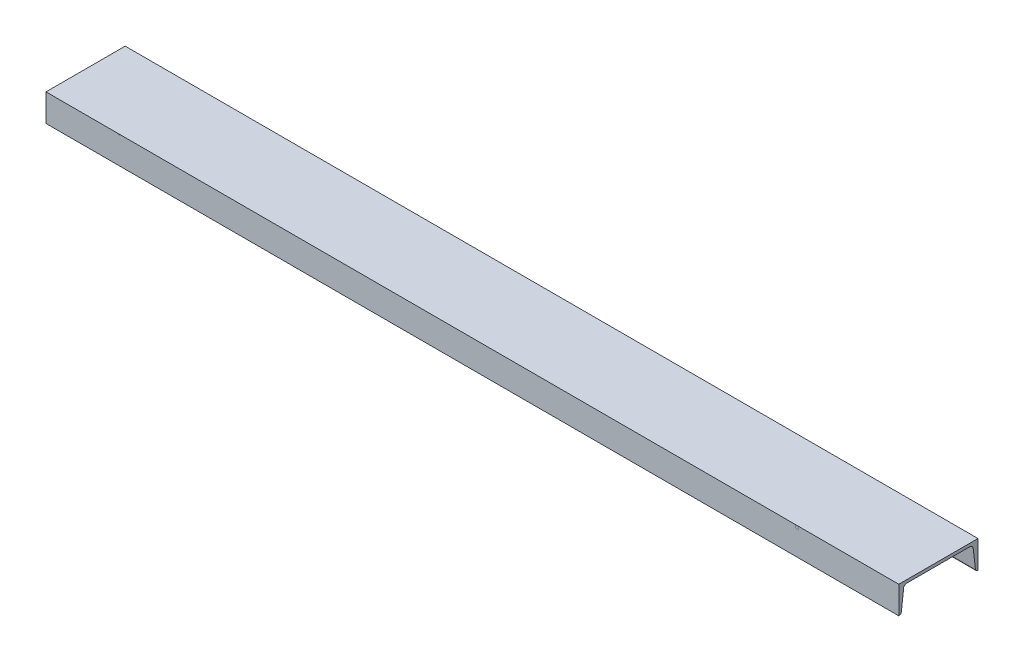
ISO-10303-21;
HEADER;
FILE_DESCRIPTION(('STEP AP214'),'2;1');
FILE_NAME('part.step','',(''),(''),'','','');
FILE_SCHEMA(('AUTOMOTIVE_DESIGN { 1 0 10303 214 1 1 1 1 }'));
ENDSEC;
DATA;
#1=APPLICATION_CONTEXT('core data for automotive mechanical design processes');
#2=APPLICATION_PROTOCOL_DEFINITION('international standard','automotive_design',2000,#1);
#3=PRODUCT_CONTEXT('',#1,'mechanical');
#4=PRODUCT('Part','Part','',(#3));
#5=PRODUCT_RELATED_PRODUCT_CATEGORY('part','',(#4));
#6=PRODUCT_DEFINITION_FORMATION('','',#4);
#7=PRODUCT_DEFINITION_CONTEXT('part definition',#1,'design');
#8=PRODUCT_DEFINITION('design','',#6,#7);
#9=PRODUCT_DEFINITION_SHAPE('','',#8);
#10=(LENGTH_UNIT() NAMED_UNIT(*) SI_UNIT(.MILLI.,.METRE.));
#11=(NAMED_UNIT(*) PLANE_ANGLE_UNIT() SI_UNIT($,.RADIAN.));
#12=(NAMED_UNIT(*) SI_UNIT($,.STERADIAN.) SOLID_ANGLE_UNIT());
#13=UNCERTAINTY_MEASURE_WITH_UNIT(LENGTH_MEASURE(1.E-05),#10,'distance_accuracy_value','');
#14=(GEOMETRIC_REPRESENTATION_CONTEXT(3) GLOBAL_UNCERTAINTY_ASSIGNED_CONTEXT((#13)) GLOBAL_UNIT_ASSIGNED_CONTEXT((#10,
#11,#12)) REPRESENTATION_CONTEXT('',''));
#15=CARTESIAN_POINT('',(0.,0.,0.));
#16=DIRECTION('',(0.,0.,1.));
#17=DIRECTION('',(1.,0.,0.));
#18=AXIS2_PLACEMENT_3D('',#15,#16,#17);
#19=CARTESIAN_POINT('',(2800.,0.,130.));
#20=DIRECTION('',(0.,0.,-1.));
#21=DIRECTION('',(-1.,0.,0.));
#22=AXIS2_PLACEMENT_3D('',#19,#20,#21);
#23=PLANE('',#22);
#24=DIRECTION('',(1.,0.,0.));
#25=VECTOR('',#24,1.);
#26=CARTESIAN_POINT('',(2460.,-10.,130.));
#27=LINE('',#26,#25);
#28=CARTESIAN_POINT('',(2460.,-10.,130.));
#29=VERTEX_POINT('',#28);
#30=CARTESIAN_POINT('',(2470.,-10.,130.));
#31=VERTEX_POINT('',#30);
#32=EDGE_CURVE('E195',#29,#31,#27,.T.);
#33=ORIENTED_EDGE('',*,*,#32,.F.);
#34=DIRECTION('',(0.,-1.,0.));
#35=VECTOR('',#34,1.);
#36=CARTESIAN_POINT('',(2460.,0.,130.));
#37=LINE('',#36,#35);
#38=CARTESIAN_POINT('',(2460.,0.,130.));
#39=VERTEX_POINT('',#38);
#40=EDGE_CURVE('E180',#39,#29,#37,.T.);
#41=ORIENTED_EDGE('',*,*,#40,.F.);
#42=DIRECTION('',(-1.,0.,0.));
#43=VECTOR('',#42,1.);
#44=CARTESIAN_POINT('',(2800.,0.,130.));
#45=LINE('',#44,#43);
#46=CARTESIAN_POINT('',(241.376099803273,0.,130.));
#47=VERTEX_POINT('',#46);
#48=EDGE_CURVE('E290',#39,#47,#45,.T.);
#49=ORIENTED_EDGE('',*,*,#48,.T.);
#50=DIRECTION('',(0.,1.,0.));
#51=VECTOR('',#50,1.);
#52=CARTESIAN_POINT('',(241.376099803273,0.,130.));
#53=LINE('',#52,#51);
#54=CARTESIAN_POINT('',(241.376099803273,-3.41175440354588,130.));
#55=VERTEX_POINT('',#54);
#56=EDGE_CURVE('E204',#55,#47,#53,.T.);
#57=ORIENTED_EDGE('',*,*,#56,.F.);
#58=DIRECTION('',(1.,0.,0.));
#59=VECTOR('',#58,1.);
#60=CARTESIAN_POINT('',(241.376099803273,-3.41175440354588,130.));
#61=LINE('',#60,#59);
#62=CARTESIAN_POINT('',(237.964345399727,-3.41175440354588,130.));
#63=VERTEX_POINT('',#62);
#64=EDGE_CURVE('E211',#63,#55,#61,.T.);
#65=ORIENTED_EDGE('',*,*,#64,.F.);
#66=DIRECTION('',(0.,-1.,0.));
#67=VECTOR('',#66,1.);
#68=CARTESIAN_POINT('',(237.964345399727,0.,130.));
#69=LINE('',#68,#67);
#70=CARTESIAN_POINT('',(237.964345399727,0.,130.));
#71=VERTEX_POINT('',#70);
#72=EDGE_CURVE('E221',#71,#63,#69,.T.);
#73=ORIENTED_EDGE('',*,*,#72,.F.);
#74=CARTESIAN_POINT('',(0.,0.,130.));
#75=VERTEX_POINT('',#74);
#76=EDGE_CURVE('E261',#71,#75,#45,.T.);
#77=ORIENTED_EDGE('',*,*,#76,.T.);
#78=DIRECTION('',(0.,-1.,0.));
#79=VECTOR('',#78,1.);
#80=CARTESIAN_POINT('',(0.,0.,130.));
#81=LINE('',#80,#79);
#82=CARTESIAN_POINT('',(0.,-90.,130.));
#83=VERTEX_POINT('',#82);
#84=EDGE_CURVE('E228',#75,#83,#81,.T.);
#85=ORIENTED_EDGE('',*,*,#84,.T.);
#86=DIRECTION('',(-1.,0.,0.));
#87=VECTOR('',#86,1.);
#88=CARTESIAN_POINT('',(2800.,-90.,130.));
#89=LINE('',#88,#87);
#90=CARTESIAN_POINT('',(2800.,-90.,130.));
#91=VERTEX_POINT('',#90);
#92=EDGE_CURVE('E11',#91,#83,#89,.T.);
#93=ORIENTED_EDGE('',*,*,#92,.F.);
#94=DIRECTION('',(0.,-1.,0.));
#95=VECTOR('',#94,1.);
#96=CARTESIAN_POINT('',(2800.,0.,130.));
#97=LINE('',#96,#95);
#98=CARTESIAN_POINT('',(2800.,0.,130.));
#99=VERTEX_POINT('',#98);
#100=EDGE_CURVE('E235',#99,#91,#97,.T.);
#101=ORIENTED_EDGE('',*,*,#100,.F.);
#102=CARTESIAN_POINT('',(2470.,0.,130.));
#103=VERTEX_POINT('',#102);
#104=EDGE_CURVE('E286',#99,#103,#45,.T.);
#105=ORIENTED_EDGE('',*,*,#104,.T.);
#106=DIRECTION('',(0.,1.,0.));
#107=VECTOR('',#106,1.);
#108=CARTESIAN_POINT('',(2470.,0.,130.));
#109=LINE('',#108,#107);
#110=EDGE_CURVE('E193',#31,#103,#109,.T.);
#111=ORIENTED_EDGE('',*,*,#110,.F.);
#112=EDGE_LOOP('',(#33,#41,#49,#57,#65,#73,#77,#85,#93,#101,#105,#111));
#113=FACE_BOUND('',#112,.T.);
#114=ADVANCED_FACE('F35',(#113),#23,.F.);
#115=CARTESIAN_POINT('',(2800.,-90.,130.));
#116=DIRECTION('',(0.,1.,0.));
#117=DIRECTION('',(0.,0.,1.));
#118=AXIS2_PLACEMENT_3D('',#115,#116,#117);
#119=PLANE('',#118);
#120=DIRECTION('',(0.,0.,-1.));
#121=VECTOR('',#120,1.);
#122=CARTESIAN_POINT('',(0.,-90.,130.));
#123=LINE('',#122,#121);
#124=CARTESIAN_POINT('',(0.,-90.,128.678333405021));
#125=VERTEX_POINT('',#124);
#126=EDGE_CURVE('E264',#83,#125,#123,.T.);
#127=ORIENTED_EDGE('',*,*,#126,.T.);
#128=DIRECTION('',(-1.,0.,0.));
#129=VECTOR('',#128,1.);
#130=CARTESIAN_POINT('',(2800.,-90.,128.678333405021));
#131=LINE('',#130,#129);
#132=CARTESIAN_POINT('',(2800.,-90.,128.678333405021));
#133=VERTEX_POINT('',#132);
#134=EDGE_CURVE('E42',#133,#125,#131,.T.);
#135=ORIENTED_EDGE('',*,*,#134,.F.);
#136=DIRECTION('',(0.,0.,-1.));
#137=VECTOR('',#136,1.);
#138=CARTESIAN_POINT('',(2800.,-90.,130.));
#139=LINE('',#138,#137);
#140=EDGE_CURVE('E238',#91,#133,#139,.T.);
#141=ORIENTED_EDGE('',*,*,#140,.F.);
#142=ORIENTED_EDGE('',*,*,#92,.T.);
#143=EDGE_LOOP('',(#127,#135,#141,#142));
#144=FACE_BOUND('',#143,.T.);
#145=ADVANCED_FACE('F344',(#144),#119,.F.);
#146=CARTESIAN_POINT('',(2800.,-83.,128.678333405021));
#147=DIRECTION('',(-1.,0.,0.));
#148=DIRECTION('',(0.,0.,1.));
#149=AXIS2_PLACEMENT_3D('',#146,#147,#148);
#150=CYLINDRICAL_SURFACE('',#149,7.00000000000001);
#151=CARTESIAN_POINT('',(0.,-83.,128.678333405021));
#152=DIRECTION('',(1.,0.,0.));
#153=DIRECTION('',(0.,0.,-1.));
#154=AXIS2_PLACEMENT_3D('',#151,#152,#153);
#155=CIRCLE('',#154,7.00000000000001);
#156=CARTESIAN_POINT('',(0.,-83.8216184771156,121.726718982597));
#157=VERTEX_POINT('',#156);
#158=EDGE_CURVE('E266',#125,#157,#155,.T.);
#159=ORIENTED_EDGE('',*,*,#158,.T.);
#160=DIRECTION('',(-1.,0.,0.));
#161=VECTOR('',#160,1.);
#162=CARTESIAN_POINT('',(2800.,-83.8216184771156,121.726718982597));
#163=LINE('',#162,#161);
#164=CARTESIAN_POINT('',(2800.,-83.8216184771156,121.726718982597));
#165=VERTEX_POINT('',#164);
#166=EDGE_CURVE('E314',#165,#157,#163,.T.);
#167=ORIENTED_EDGE('',*,*,#166,.F.);
#168=CARTESIAN_POINT('',(2800.,-83.,128.678333405021));
#169=DIRECTION('',(1.,0.,0.));
#170=DIRECTION('',(0.,0.,-1.));
#171=AXIS2_PLACEMENT_3D('',#168,#169,#170);
#172=CIRCLE('',#171,7.00000000000001);
#173=EDGE_CURVE('E241',#133,#165,#172,.T.);
#174=ORIENTED_EDGE('',*,*,#173,.F.);
#175=ORIENTED_EDGE('',*,*,#134,.T.);
#176=EDGE_LOOP('',(#159,#167,#174,#175));
#177=FACE_BOUND('',#176,.T.);
#178=ADVANCED_FACE('F321',(#177),#150,.T.);
#179=CARTESIAN_POINT('',(2800.,-16.7206222894941,113.795983048398));
#180=DIRECTION('',(0.,0.117374068159373,0.993087774632091));
#181=DIRECTION('',(0.,-0.993087774632091,0.117374068159373));
#182=AXIS2_PLACEMENT_3D('',#179,#180,#181);
#183=PLANE('',#182);
#184=DIRECTION('',(0.,0.993087774632091,-0.117374068159373));
#185=VECTOR('',#184,1.);
#186=CARTESIAN_POINT('',(0.,-16.7206222894941,113.795983048398));
#187=LINE('',#186,#185);
#188=CARTESIAN_POINT('',(0.,-16.7206222894941,113.795983048398));
#189=VERTEX_POINT('',#188);
#190=EDGE_CURVE('E268',#157,#189,#187,.T.);
#191=ORIENTED_EDGE('',*,*,#190,.T.);
#192=DIRECTION('',(-1.,0.,0.));
#193=VECTOR('',#192,1.);
#194=CARTESIAN_POINT('',(2800.,-16.7206222894941,113.795983048398));
#195=LINE('',#194,#193);
#196=CARTESIAN_POINT('',(2800.,-16.7206222894941,113.795983048398));
#197=VERTEX_POINT('',#196);
#198=EDGE_CURVE('E311',#197,#189,#195,.T.);
#199=ORIENTED_EDGE('',*,*,#198,.F.);
#200=DIRECTION('',(0.,0.993087774632091,-0.117374068159373));
#201=VECTOR('',#200,1.);
#202=CARTESIAN_POINT('',(2800.,-16.7206222894941,113.795983048398));
#203=LINE('',#202,#201);
#204=EDGE_CURVE('E243',#165,#197,#203,.T.);
#205=ORIENTED_EDGE('',*,*,#204,.F.);
#206=ORIENTED_EDGE('',*,*,#166,.T.);
#207=EDGE_LOOP('',(#191,#199,#205,#206));
#208=FACE_BOUND('',#207,.T.);
#209=ADVANCED_FACE('F332',(#208),#183,.F.);
#210=CARTESIAN_POINT('',(2800.,-24.,101.837276590433));
#211=DIRECTION('',(-1.,0.,0.));
#212=DIRECTION('',(0.,0.,1.));
#213=AXIS2_PLACEMENT_3D('',#210,#211,#212);
#214=CYLINDRICAL_SURFACE('',#213,14.);
#215=CARTESIAN_POINT('',(0.,-24.,101.837276590433));
#216=DIRECTION('',(-1.,0.,0.));
#217=DIRECTION('',(0.,0.,-1.));
#218=AXIS2_PLACEMENT_3D('',#215,#216,#217);
#219=CIRCLE('',#218,14.);
#220=CARTESIAN_POINT('',(0.,-10.,101.837276590433));
#221=VERTEX_POINT('',#220);
#222=EDGE_CURVE('E270',#189,#221,#219,.T.);
#223=ORIENTED_EDGE('',*,*,#222,.T.);
#224=DIRECTION('',(-1.,0.,0.));
#225=VECTOR('',#224,1.);
#226=CARTESIAN_POINT('',(2800.,-10.,101.837276590433));
#227=LINE('',#226,#225);
#228=CARTESIAN_POINT('',(2800.,-10.,101.837276590433));
#229=VERTEX_POINT('',#228);
#230=EDGE_CURVE('E308',#229,#221,#227,.T.);
#231=ORIENTED_EDGE('',*,*,#230,.F.);
#232=CARTESIAN_POINT('',(2800.,-24.,101.837276590433));
#233=DIRECTION('',(-1.,0.,0.));
#234=DIRECTION('',(0.,0.,-1.));
#235=AXIS2_PLACEMENT_3D('',#232,#233,#234);
#236=CIRCLE('',#235,14.);
#237=EDGE_CURVE('E245',#197,#229,#236,.T.);
#238=ORIENTED_EDGE('',*,*,#237,.F.);
#239=ORIENTED_EDGE('',*,*,#198,.T.);
#240=EDGE_LOOP('',(#223,#231,#238,#239));
#241=FACE_BOUND('',#240,.T.);
#242=ADVANCED_FACE('F336',(#241),#214,.F.);
#243=CARTESIAN_POINT('',(2800.,-9.99999999999998,-101.837276590433));
#244=DIRECTION('',(0.,1.,0.));
#245=DIRECTION('',(0.,0.,1.));
#246=AXIS2_PLACEMENT_3D('',#243,#244,#245);
#247=PLANE('',#246);
#248=DIRECTION('',(0.,0.,-1.));
#249=VECTOR('',#248,1.);
#250=CARTESIAN_POINT('',(0.,-9.99999999999998,-101.837276590433));
#251=LINE('',#250,#249);
#252=CARTESIAN_POINT('',(0.,-9.99999999999997,-101.837276590433));
#253=VERTEX_POINT('',#252);
#254=EDGE_CURVE('E272',#221,#253,#251,.T.);
#255=ORIENTED_EDGE('',*,*,#254,.T.);
#256=DIRECTION('',(-1.,0.,0.));
#257=VECTOR('',#256,1.);
#258=CARTESIAN_POINT('',(2800.,-9.99999999999997,-101.837276590433));
#259=LINE('',#258,#257);
#260=CARTESIAN_POINT('',(2800.,-9.99999999999997,-101.837276590433));
#261=VERTEX_POINT('',#260);
#262=EDGE_CURVE('E305',#261,#253,#259,.T.);
#263=ORIENTED_EDGE('',*,*,#262,.F.);
#264=DIRECTION('',(0.,0.,-1.));
#265=VECTOR('',#264,1.);
#266=CARTESIAN_POINT('',(2800.,-9.99999999999998,-101.837276590433));
#267=LINE('',#266,#265);
#268=EDGE_CURVE('E247',#229,#261,#267,.T.);
#269=ORIENTED_EDGE('',*,*,#268,.F.);
#270=ORIENTED_EDGE('',*,*,#230,.T.);
#271=EDGE_LOOP('',(#255,#263,#269,#270));
#272=FACE_BOUND('',#271,.T.);
#273=ADVANCED_FACE('F381',(#272),#247,.F.);
#274=CARTESIAN_POINT('',(2800.,-24.,-101.837276590433));
#275=DIRECTION('',(-1.,0.,0.));
#276=DIRECTION('',(0.,0.,1.));
#277=AXIS2_PLACEMENT_3D('',#274,#275,#276);
#278=CYLINDRICAL_SURFACE('',#277,14.);
#279=CARTESIAN_POINT('',(0.,-24.,-101.837276590433));
#280=DIRECTION('',(-1.,0.,0.));
#281=DIRECTION('',(0.,0.,1.));
#282=AXIS2_PLACEMENT_3D('',#279,#280,#281);
#283=CIRCLE('',#282,14.);
#284=CARTESIAN_POINT('',(0.,-16.7206222894941,-113.795983048398));
#285=VERTEX_POINT('',#284);
#286=EDGE_CURVE('E274',#253,#285,#283,.T.);
#287=ORIENTED_EDGE('',*,*,#286,.T.);
#288=DIRECTION('',(-1.,0.,0.));
#289=VECTOR('',#288,1.);
#290=CARTESIAN_POINT('',(2800.,-16.7206222894941,-113.795983048398));
#291=LINE('',#290,#289);
#292=CARTESIAN_POINT('',(2800.,-16.7206222894941,-113.795983048398));
#293=VERTEX_POINT('',#292);
#294=EDGE_CURVE('E302',#293,#285,#291,.T.);
#295=ORIENTED_EDGE('',*,*,#294,.F.);
#296=CARTESIAN_POINT('',(2800.,-24.,-101.837276590433));
#297=DIRECTION('',(-1.,0.,0.));
#298=DIRECTION('',(0.,0.,1.));
#299=AXIS2_PLACEMENT_3D('',#296,#297,#298);
#300=CIRCLE('',#299,14.);
#301=EDGE_CURVE('E249',#261,#293,#300,.T.);
#302=ORIENTED_EDGE('',*,*,#301,.F.);
#303=ORIENTED_EDGE('',*,*,#262,.T.);
#304=EDGE_LOOP('',(#287,#295,#302,#303));
#305=FACE_BOUND('',#304,.T.);
#306=ADVANCED_FACE('F379',(#305),#278,.F.);
#307=CARTESIAN_POINT('',(2800.,-16.7206222894941,-113.795983048398));
#308=DIRECTION('',(0.,0.117374068159373,-0.993087774632091));
#309=DIRECTION('',(0.,0.993087774632091,0.117374068159373));
#310=AXIS2_PLACEMENT_3D('',#307,#308,#309);
#311=PLANE('',#310);
#312=DIRECTION('',(0.,-0.993087774632091,-0.117374068159373));
#313=VECTOR('',#312,1.);
#314=CARTESIAN_POINT('',(0.,-16.7206222894941,-113.795983048398));
#315=LINE('',#314,#313);
#316=CARTESIAN_POINT('',(0.,-83.8216184771156,-121.726718982597));
#317=VERTEX_POINT('',#316);
#318=EDGE_CURVE('E276',#285,#317,#315,.T.);
#319=ORIENTED_EDGE('',*,*,#318,.T.);
#320=DIRECTION('',(-1.,0.,0.));
#321=VECTOR('',#320,1.);
#322=CARTESIAN_POINT('',(2800.,-83.8216184771156,-121.726718982597));
#323=LINE('',#322,#321);
#324=CARTESIAN_POINT('',(2800.,-83.8216184771156,-121.726718982597));
#325=VERTEX_POINT('',#324);
#326=EDGE_CURVE('E299',#325,#317,#323,.T.);
#327=ORIENTED_EDGE('',*,*,#326,.F.);
#328=DIRECTION('',(0.,-0.993087774632091,-0.117374068159373));
#329=VECTOR('',#328,1.);
#330=CARTESIAN_POINT('',(2800.,-16.7206222894941,-113.795983048398));
#331=LINE('',#330,#329);
#332=EDGE_CURVE('E251',#293,#325,#331,.T.);
#333=ORIENTED_EDGE('',*,*,#332,.F.);
#334=ORIENTED_EDGE('',*,*,#294,.T.);
#335=EDGE_LOOP('',(#319,#327,#333,#334));
#336=FACE_BOUND('',#335,.T.);
#337=ADVANCED_FACE('F375',(#336),#311,.F.);
#338=CARTESIAN_POINT('',(2800.,-83.,-128.678333405021));
#339=DIRECTION('',(-1.,0.,0.));
#340=DIRECTION('',(0.,0.,1.));
#341=AXIS2_PLACEMENT_3D('',#338,#339,#340);
#342=CYLINDRICAL_SURFACE('',#341,6.99999999999999);
#343=CARTESIAN_POINT('',(0.,-83.,-128.678333405021));
#344=DIRECTION('',(1.,0.,0.));
#345=DIRECTION('',(0.,0.,1.));
#346=AXIS2_PLACEMENT_3D('',#343,#344,#345);
#347=CIRCLE('',#346,6.99999999999999);
#348=CARTESIAN_POINT('',(0.,-90.,-128.678333405021));
#349=VERTEX_POINT('',#348);
#350=EDGE_CURVE('E278',#317,#349,#347,.T.);
#351=ORIENTED_EDGE('',*,*,#350,.T.);
#352=DIRECTION('',(-1.,0.,0.));
#353=VECTOR('',#352,1.);
#354=CARTESIAN_POINT('',(2800.,-90.,-128.678333405021));
#355=LINE('',#354,#353);
#356=CARTESIAN_POINT('',(2800.,-90.,-128.678333405021));
#357=VERTEX_POINT('',#356);
#358=EDGE_CURVE('E296',#357,#349,#355,.T.);
#359=ORIENTED_EDGE('',*,*,#358,.F.);
#360=CARTESIAN_POINT('',(2800.,-83.,-128.678333405021));
#361=DIRECTION('',(1.,0.,0.));
#362=DIRECTION('',(0.,0.,1.));
#363=AXIS2_PLACEMENT_3D('',#360,#361,#362);
#364=CIRCLE('',#363,6.99999999999999);
#365=EDGE_CURVE('E253',#325,#357,#364,.T.);
#366=ORIENTED_EDGE('',*,*,#365,.F.);
#367=ORIENTED_EDGE('',*,*,#326,.T.);
#368=EDGE_LOOP('',(#351,#359,#366,#367));
#369=FACE_BOUND('',#368,.T.);
#370=ADVANCED_FACE('F370',(#369),#342,.T.);
#371=CARTESIAN_POINT('',(2800.,-90.,-130.));
#372=DIRECTION('',(0.,1.,0.));
#373=DIRECTION('',(0.,0.,1.));
#374=AXIS2_PLACEMENT_3D('',#371,#372,#373);
#375=PLANE('',#374);
#376=DIRECTION('',(0.,0.,-1.));
#377=VECTOR('',#376,1.);
#378=CARTESIAN_POINT('',(0.,-90.,-130.));
#379=LINE('',#378,#377);
#380=CARTESIAN_POINT('',(0.,-90.,-130.));
#381=VERTEX_POINT('',#380);
#382=EDGE_CURVE('E280',#349,#381,#379,.T.);
#383=ORIENTED_EDGE('',*,*,#382,.T.);
#384=DIRECTION('',(-1.,0.,0.));
#385=VECTOR('',#384,1.);
#386=CARTESIAN_POINT('',(2800.,-90.,-130.));
#387=LINE('',#386,#385);
#388=CARTESIAN_POINT('',(2800.,-90.,-130.));
#389=VERTEX_POINT('',#388);
#390=EDGE_CURVE('E293',#389,#381,#387,.T.);
#391=ORIENTED_EDGE('',*,*,#390,.F.);
#392=DIRECTION('',(0.,0.,-1.));
#393=VECTOR('',#392,1.);
#394=CARTESIAN_POINT('',(2800.,-90.,-130.));
#395=LINE('',#394,#393);
#396=EDGE_CURVE('E255',#357,#389,#395,.T.);
#397=ORIENTED_EDGE('',*,*,#396,.F.);
#398=ORIENTED_EDGE('',*,*,#358,.T.);
#399=EDGE_LOOP('',(#383,#391,#397,#398));
#400=FACE_BOUND('',#399,.T.);
#401=ADVANCED_FACE('F364',(#400),#375,.F.);
#402=CARTESIAN_POINT('',(2800.,0.,-130.));
#403=DIRECTION('',(0.,0.,1.));
#404=DIRECTION('',(1.,0.,0.));
#405=AXIS2_PLACEMENT_3D('',#402,#403,#404);
#406=PLANE('',#405);
#407=DIRECTION('',(0.,1.,0.));
#408=VECTOR('',#407,1.);
#409=CARTESIAN_POINT('',(0.,0.,-130.));
#410=LINE('',#409,#408);
#411=CARTESIAN_POINT('',(0.,0.,-130.));
#412=VERTEX_POINT('',#411);
#413=EDGE_CURVE('E282',#381,#412,#410,.T.);
#414=ORIENTED_EDGE('',*,*,#413,.T.);
#415=DIRECTION('',(-1.,0.,0.));
#416=VECTOR('',#415,1.);
#417=CARTESIAN_POINT('',(2800.,0.,-130.));
#418=LINE('',#417,#416);
#419=CARTESIAN_POINT('',(2800.,0.,-130.));
#420=VERTEX_POINT('',#419);
#421=EDGE_CURVE('E289',#420,#412,#418,.T.);
#422=ORIENTED_EDGE('',*,*,#421,.F.);
#423=DIRECTION('',(0.,1.,0.));
#424=VECTOR('',#423,1.);
#425=CARTESIAN_POINT('',(2800.,0.,-130.));
#426=LINE('',#425,#424);
#427=EDGE_CURVE('E257',#389,#420,#426,.T.);
#428=ORIENTED_EDGE('',*,*,#427,.F.);
#429=ORIENTED_EDGE('',*,*,#390,.T.);
#430=EDGE_LOOP('',(#414,#422,#428,#429));
#431=FACE_BOUND('',#430,.T.);
#432=ADVANCED_FACE('F360',(#431),#406,.F.);
#433=CARTESIAN_POINT('',(2800.,0.,-130.));
#434=DIRECTION('',(0.,-1.,0.));
#435=DIRECTION('',(0.,0.,-1.));
#436=AXIS2_PLACEMENT_3D('',#433,#434,#435);
#437=PLANE('',#436);
#438=ORIENTED_EDGE('',*,*,#48,.F.);
#439=DIRECTION('',(0.,0.,1.));
#440=VECTOR('',#439,1.);
#441=CARTESIAN_POINT('',(2460.,0.,129.99));
#442=LINE('',#441,#440);
#443=CARTESIAN_POINT('',(2460.,0.,129.99));
#444=VERTEX_POINT('',#443);
#445=EDGE_CURVE('E202',#444,#39,#442,.T.);
#446=ORIENTED_EDGE('',*,*,#445,.F.);
#447=DIRECTION('',(-1.,0.,0.));
#448=VECTOR('',#447,1.);
#449=CARTESIAN_POINT('',(2460.,0.,129.99));
#450=LINE('',#449,#448);
#451=CARTESIAN_POINT('',(2470.,0.,129.99));
#452=VERTEX_POINT('',#451);
#453=EDGE_CURVE('E185',#452,#444,#450,.T.);
#454=ORIENTED_EDGE('',*,*,#453,.F.);
#455=DIRECTION('',(0.,0.,1.));
#456=VECTOR('',#455,1.);
#457=CARTESIAN_POINT('',(2470.,0.,129.99));
#458=LINE('',#457,#456);
#459=EDGE_CURVE('E205',#452,#103,#458,.T.);
#460=ORIENTED_EDGE('',*,*,#459,.T.);
#461=ORIENTED_EDGE('',*,*,#104,.F.);
#462=DIRECTION('',(0.,0.,1.));
#463=VECTOR('',#462,1.);
#464=CARTESIAN_POINT('',(2800.,0.,-130.));
#465=LINE('',#464,#463);
#466=EDGE_CURVE('E259',#420,#99,#465,.T.);
#467=ORIENTED_EDGE('',*,*,#466,.F.);
#468=ORIENTED_EDGE('',*,*,#421,.T.);
#469=DIRECTION('',(0.,0.,1.));
#470=VECTOR('',#469,1.);
#471=CARTESIAN_POINT('',(0.,0.,-130.));
#472=LINE('',#471,#470);
#473=EDGE_CURVE('E239',#412,#75,#472,.T.);
#474=ORIENTED_EDGE('',*,*,#473,.T.);
#475=ORIENTED_EDGE('',*,*,#76,.F.);
#476=DIRECTION('',(0.,0.,1.));
#477=VECTOR('',#476,1.);
#478=CARTESIAN_POINT('',(237.964345399727,0.,129.99));
#479=LINE('',#478,#477);
#480=CARTESIAN_POINT('',(237.964345399727,0.,129.99));
#481=VERTEX_POINT('',#480);
#482=EDGE_CURVE('E231',#481,#71,#479,.T.);
#483=ORIENTED_EDGE('',*,*,#482,.F.);
#484=DIRECTION('',(-1.,0.,0.));
#485=VECTOR('',#484,1.);
#486=CARTESIAN_POINT('',(241.376099803273,0.,129.99));
#487=LINE('',#486,#485);
#488=CARTESIAN_POINT('',(241.376099803273,0.,129.99));
#489=VERTEX_POINT('',#488);
#490=EDGE_CURVE('E210',#489,#481,#487,.T.);
#491=ORIENTED_EDGE('',*,*,#490,.F.);
#492=DIRECTION('',(0.,0.,1.));
#493=VECTOR('',#492,1.);
#494=CARTESIAN_POINT('',(241.376099803273,0.,129.99));
#495=LINE('',#494,#493);
#496=EDGE_CURVE('E218',#489,#47,#495,.T.);
#497=ORIENTED_EDGE('',*,*,#496,.T.);
#498=EDGE_LOOP('',(#438,#446,#454,#460,#461,#467,#468,#474,#475,#483,#491,#497));
#499=FACE_BOUND('',#498,.T.);
#500=ADVANCED_FACE('F353',(#499),#437,.F.);
#501=CARTESIAN_POINT('',(2800.,-83.,128.678333405021));
#502=DIRECTION('',(1.,0.,0.));
#503=DIRECTION('',(0.,0.,-1.));
#504=AXIS2_PLACEMENT_3D('',#501,#502,#503);
#505=PLANE('',#504);
#506=ORIENTED_EDGE('',*,*,#100,.T.);
#507=ORIENTED_EDGE('',*,*,#140,.T.);
#508=ORIENTED_EDGE('',*,*,#173,.T.);
#509=ORIENTED_EDGE('',*,*,#204,.T.);
#510=ORIENTED_EDGE('',*,*,#237,.T.);
#511=ORIENTED_EDGE('',*,*,#268,.T.);
#512=ORIENTED_EDGE('',*,*,#301,.T.);
#513=ORIENTED_EDGE('',*,*,#332,.T.);
#514=ORIENTED_EDGE('',*,*,#365,.T.);
#515=ORIENTED_EDGE('',*,*,#396,.T.);
#516=ORIENTED_EDGE('',*,*,#427,.T.);
#517=ORIENTED_EDGE('',*,*,#466,.T.);
#518=EDGE_LOOP('',(#506,#507,#508,#509,#510,#511,#512,#513,#514,#515,#516,#517));
#519=FACE_BOUND('',#518,.T.);
#520=ADVANCED_FACE('F340',(#519),#505,.T.);
#521=CARTESIAN_POINT('',(0.,-83.,128.678333405021));
#522=DIRECTION('',(1.,0.,0.));
#523=DIRECTION('',(0.,0.,-1.));
#524=AXIS2_PLACEMENT_3D('',#521,#522,#523);
#525=PLANE('',#524);
#526=ORIENTED_EDGE('',*,*,#84,.F.);
#527=ORIENTED_EDGE('',*,*,#473,.F.);
#528=ORIENTED_EDGE('',*,*,#413,.F.);
#529=ORIENTED_EDGE('',*,*,#382,.F.);
#530=ORIENTED_EDGE('',*,*,#350,.F.);
#531=ORIENTED_EDGE('',*,*,#318,.F.);
#532=ORIENTED_EDGE('',*,*,#286,.F.);
#533=ORIENTED_EDGE('',*,*,#254,.F.);
#534=ORIENTED_EDGE('',*,*,#222,.F.);
#535=ORIENTED_EDGE('',*,*,#190,.F.);
#536=ORIENTED_EDGE('',*,*,#158,.F.);
#537=ORIENTED_EDGE('',*,*,#126,.F.);
#538=EDGE_LOOP('',(#526,#527,#528,#529,#530,#531,#532,#533,#534,#535,#536,#537));
#539=FACE_BOUND('',#538,.T.);
#540=ADVANCED_FACE('F327',(#539),#525,.F.);
#541=CARTESIAN_POINT('',(241.376099803273,0.,129.99));
#542=DIRECTION('',(1.,0.,0.));
#543=DIRECTION('',(0.,0.,-1.));
#544=AXIS2_PLACEMENT_3D('',#541,#542,#543);
#545=PLANE('',#544);
#546=ORIENTED_EDGE('',*,*,#56,.T.);
#547=ORIENTED_EDGE('',*,*,#496,.F.);
#548=DIRECTION('',(0.,1.,0.));
#549=VECTOR('',#548,1.);
#550=CARTESIAN_POINT('',(241.376099803273,0.,129.99));
#551=LINE('',#550,#549);
#552=CARTESIAN_POINT('',(241.376099803273,-3.41175440354588,129.99));
#553=VERTEX_POINT('',#552);
#554=EDGE_CURVE('E57',#553,#489,#551,.T.);
#555=ORIENTED_EDGE('',*,*,#554,.F.);
#556=DIRECTION('',(0.,0.,1.));
#557=VECTOR('',#556,1.);
#558=CARTESIAN_POINT('',(241.376099803273,-3.41175440354588,129.99));
#559=LINE('',#558,#557);
#560=EDGE_CURVE('E226',#553,#55,#559,.T.);
#561=ORIENTED_EDGE('',*,*,#560,.T.);
#562=EDGE_LOOP('',(#546,#547,#555,#561));
#563=FACE_BOUND('',#562,.T.);
#564=ADVANCED_FACE('F471',(#563),#545,.F.);
#565=CARTESIAN_POINT('',(241.376099803273,-3.41175440354588,129.99));
#566=DIRECTION('',(0.,-1.,0.));
#567=DIRECTION('',(1.,0.,0.));
#568=AXIS2_PLACEMENT_3D('',#565,#566,#567);
#569=PLANE('',#568);
#570=ORIENTED_EDGE('',*,*,#64,.T.);
#571=ORIENTED_EDGE('',*,*,#560,.F.);
#572=DIRECTION('',(1.,0.,0.));
#573=VECTOR('',#572,1.);
#574=CARTESIAN_POINT('',(241.376099803273,-3.41175440354588,129.99));
#575=LINE('',#574,#573);
#576=CARTESIAN_POINT('',(237.964345399727,-3.41175440354588,129.99));
#577=VERTEX_POINT('',#576);
#578=EDGE_CURVE('E216',#577,#553,#575,.T.);
#579=ORIENTED_EDGE('',*,*,#578,.F.);
#580=DIRECTION('',(0.,0.,1.));
#581=VECTOR('',#580,1.);
#582=CARTESIAN_POINT('',(237.964345399727,-3.41175440354588,129.99));
#583=LINE('',#582,#581);
#584=EDGE_CURVE('E229',#577,#63,#583,.T.);
#585=ORIENTED_EDGE('',*,*,#584,.T.);
#586=EDGE_LOOP('',(#570,#571,#579,#585));
#587=FACE_BOUND('',#586,.T.);
#588=ADVANCED_FACE('F480',(#587),#569,.F.);
#589=CARTESIAN_POINT('',(237.964345399727,0.,129.99));
#590=DIRECTION('',(-1.,0.,0.));
#591=DIRECTION('',(0.,0.,1.));
#592=AXIS2_PLACEMENT_3D('',#589,#590,#591);
#593=PLANE('',#592);
#594=ORIENTED_EDGE('',*,*,#72,.T.);
#595=ORIENTED_EDGE('',*,*,#584,.F.);
#596=DIRECTION('',(0.,-1.,0.));
#597=VECTOR('',#596,1.);
#598=CARTESIAN_POINT('',(237.964345399727,0.,129.99));
#599=LINE('',#598,#597);
#600=EDGE_CURVE('E213',#481,#577,#599,.T.);
#601=ORIENTED_EDGE('',*,*,#600,.F.);
#602=ORIENTED_EDGE('',*,*,#482,.T.);
#603=EDGE_LOOP('',(#594,#595,#601,#602));
#604=FACE_BOUND('',#603,.T.);
#605=ADVANCED_FACE('F490',(#604),#593,.F.);
#606=CARTESIAN_POINT('',(0.,0.,129.99));
#607=DIRECTION('',(0.,0.,-1.));
#608=DIRECTION('',(-1.,0.,0.));
#609=AXIS2_PLACEMENT_3D('',#606,#607,#608);
#610=PLANE('',#609);
#611=ORIENTED_EDGE('',*,*,#554,.T.);
#612=ORIENTED_EDGE('',*,*,#490,.T.);
#613=ORIENTED_EDGE('',*,*,#600,.T.);
#614=ORIENTED_EDGE('',*,*,#578,.T.);
#615=EDGE_LOOP('',(#611,#612,#613,#614));
#616=FACE_BOUND('',#615,.T.);
#617=ADVANCED_FACE('F499',(#616),#610,.F.);
#618=CARTESIAN_POINT('',(2460.,0.,129.99));
#619=DIRECTION('',(-1.,0.,0.));
#620=DIRECTION('',(0.,-1.,0.));
#621=AXIS2_PLACEMENT_3D('',#618,#619,#620);
#622=PLANE('',#621);
#623=ORIENTED_EDGE('',*,*,#40,.T.);
#624=DIRECTION('',(0.,0.,1.));
#625=VECTOR('',#624,1.);
#626=CARTESIAN_POINT('',(2460.,-10.,129.99));
#627=LINE('',#626,#625);
#628=CARTESIAN_POINT('',(2460.,-10.,129.99));
#629=VERTEX_POINT('',#628);
#630=EDGE_CURVE('E174',#629,#29,#627,.T.);
#631=ORIENTED_EDGE('',*,*,#630,.F.);
#632=DIRECTION('',(0.,-1.,0.));
#633=VECTOR('',#632,1.);
#634=CARTESIAN_POINT('',(2460.,0.,129.99));
#635=LINE('',#634,#633);
#636=EDGE_CURVE('E178',#444,#629,#635,.T.);
#637=ORIENTED_EDGE('',*,*,#636,.F.);
#638=ORIENTED_EDGE('',*,*,#445,.T.);
#639=EDGE_LOOP('',(#623,#631,#637,#638));
#640=FACE_BOUND('',#639,.T.);
#641=ADVANCED_FACE('F176',(#640),#622,.F.);
#642=CARTESIAN_POINT('',(2470.,0.,129.99));
#643=DIRECTION('',(1.,0.,0.));
#644=DIRECTION('',(0.,1.,0.));
#645=AXIS2_PLACEMENT_3D('',#642,#643,#644);
#646=PLANE('',#645);
#647=ORIENTED_EDGE('',*,*,#110,.T.);
#648=ORIENTED_EDGE('',*,*,#459,.F.);
#649=DIRECTION('',(0.,1.,0.));
#650=VECTOR('',#649,1.);
#651=CARTESIAN_POINT('',(2470.,0.,129.99));
#652=LINE('',#651,#650);
#653=CARTESIAN_POINT('',(2470.,-10.,129.99));
#654=VERTEX_POINT('',#653);
#655=EDGE_CURVE('E49',#654,#452,#652,.T.);
#656=ORIENTED_EDGE('',*,*,#655,.F.);
#657=DIRECTION('',(0.,0.,1.));
#658=VECTOR('',#657,1.);
#659=CARTESIAN_POINT('',(2470.,-10.,129.99));
#660=LINE('',#659,#658);
#661=EDGE_CURVE('E184',#654,#31,#660,.T.);
#662=ORIENTED_EDGE('',*,*,#661,.T.);
#663=EDGE_LOOP('',(#647,#648,#656,#662));
#664=FACE_BOUND('',#663,.T.);
#665=ADVANCED_FACE('F517',(#664),#646,.F.);
#666=CARTESIAN_POINT('',(2460.,-10.,129.99));
#667=DIRECTION('',(0.,-1.,0.));
#668=DIRECTION('',(0.,0.,-1.));
#669=AXIS2_PLACEMENT_3D('',#666,#667,#668);
#670=PLANE('',#669);
#671=ORIENTED_EDGE('',*,*,#32,.T.);
#672=ORIENTED_EDGE('',*,*,#661,.F.);
#673=DIRECTION('',(1.,0.,0.));
#674=VECTOR('',#673,1.);
#675=CARTESIAN_POINT('',(2460.,-10.,129.99));
#676=LINE('',#675,#674);
#677=EDGE_CURVE('E187',#629,#654,#676,.T.);
#678=ORIENTED_EDGE('',*,*,#677,.F.);
#679=ORIENTED_EDGE('',*,*,#630,.T.);
#680=EDGE_LOOP('',(#671,#672,#678,#679));
#681=FACE_BOUND('',#680,.T.);
#682=ADVANCED_FACE('F188',(#681),#670,.F.);
#683=CARTESIAN_POINT('',(0.,0.,129.99));
#684=DIRECTION('',(0.,0.,1.));
#685=DIRECTION('',(1.,0.,0.));
#686=AXIS2_PLACEMENT_3D('',#683,#684,#685);
#687=PLANE('',#686);
#688=ORIENTED_EDGE('',*,*,#636,.T.);
#689=ORIENTED_EDGE('',*,*,#677,.T.);
#690=ORIENTED_EDGE('',*,*,#655,.T.);
#691=ORIENTED_EDGE('',*,*,#453,.T.);
#692=EDGE_LOOP('',(#688,#689,#690,#691));
#693=FACE_BOUND('',#692,.T.);
#694=ADVANCED_FACE('F190',(#693),#687,.T.);
#695=CLOSED_SHELL('',(#114,#145,#178,#209,#242,#273,#306,#337,#370,#401,#432,#500,#520,#540,
#564,#588,#605,#617,#641,#665,#682,#694));
#696=MANIFOLD_SOLID_BREP('B2',#695);
#697=ADVANCED_BREP_SHAPE_REPRESENTATION('',(#18,#696),#14);
#698=SHAPE_DEFINITION_REPRESENTATION(#9,#697);
ENDSEC;
END-ISO-10303-21;
